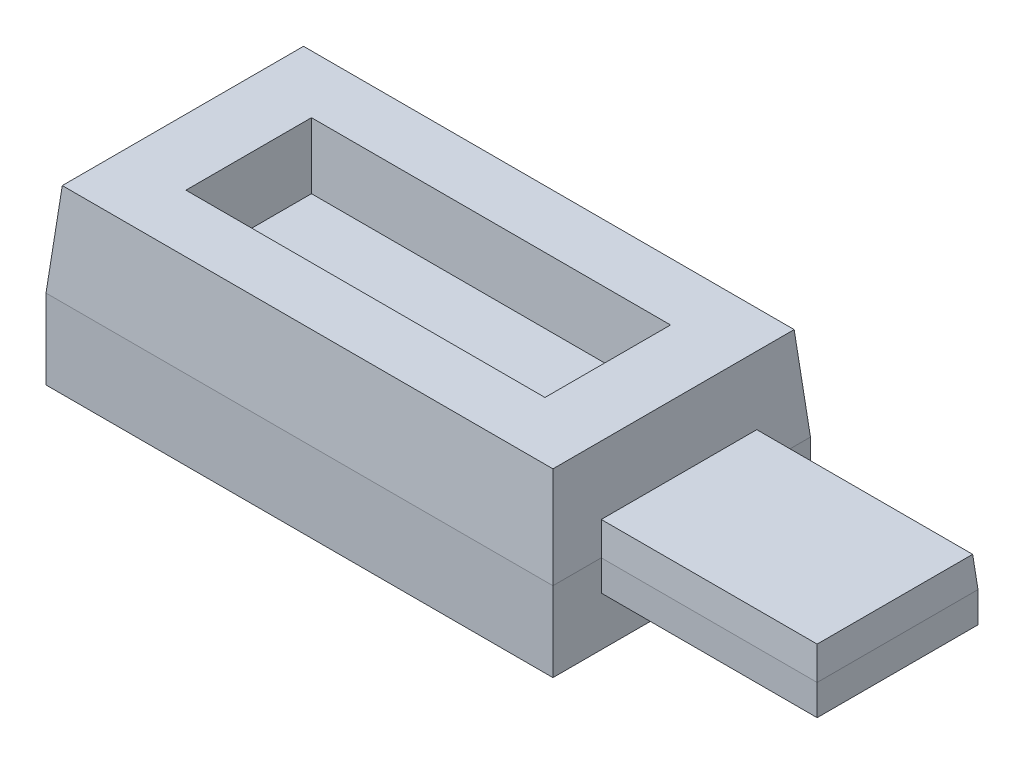
ISO-10303-21;
HEADER;
FILE_DESCRIPTION(('STEP AP214'),'2;1');
FILE_NAME('part.step','',(''),(''),'','','');
FILE_SCHEMA(('AUTOMOTIVE_DESIGN { 1 0 10303 214 1 1 1 1 }'));
ENDSEC;
DATA;
#1=APPLICATION_CONTEXT('core data for automotive mechanical design processes');
#2=APPLICATION_PROTOCOL_DEFINITION('international standard','automotive_design',2000,#1);
#3=PRODUCT_CONTEXT('',#1,'mechanical');
#4=PRODUCT('Part','Part','',(#3));
#5=PRODUCT_RELATED_PRODUCT_CATEGORY('part','',(#4));
#6=PRODUCT_DEFINITION_FORMATION('','',#4);
#7=PRODUCT_DEFINITION_CONTEXT('part definition',#1,'design');
#8=PRODUCT_DEFINITION('design','',#6,#7);
#9=PRODUCT_DEFINITION_SHAPE('','',#8);
#10=(LENGTH_UNIT() NAMED_UNIT(*) SI_UNIT(.MILLI.,.METRE.));
#11=(NAMED_UNIT(*) PLANE_ANGLE_UNIT() SI_UNIT($,.RADIAN.));
#12=(NAMED_UNIT(*) SI_UNIT($,.STERADIAN.) SOLID_ANGLE_UNIT());
#13=UNCERTAINTY_MEASURE_WITH_UNIT(LENGTH_MEASURE(1.E-05),#10,'distance_accuracy_value','');
#14=(GEOMETRIC_REPRESENTATION_CONTEXT(3) GLOBAL_UNCERTAINTY_ASSIGNED_CONTEXT((#13)) GLOBAL_UNIT_ASSIGNED_CONTEXT((#10,
#11,#12)) REPRESENTATION_CONTEXT('',''));
#15=CARTESIAN_POINT('',(0.,0.,0.));
#16=DIRECTION('',(0.,0.,1.));
#17=DIRECTION('',(1.,0.,0.));
#18=AXIS2_PLACEMENT_3D('',#15,#16,#17);
#19=CARTESIAN_POINT('',(-102.892841401862,32.3217631467672,52.2673742227546));
#20=DIRECTION('',(-0.996194698091746,0.0871557427476582,0.));
#21=DIRECTION('',(-0.0871557427476582,-0.996194698091746,0.));
#22=AXIS2_PLACEMENT_3D('',#19,#20,#21);
#23=PLANE('',#22);
#24=DIRECTION('',(0.,0.,-1.));
#25=VECTOR('',#24,1.);
#26=CARTESIAN_POINT('',(-102.892841401862,32.3217631467672,52.2673742227546));
#27=LINE('',#26,#25);
#28=CARTESIAN_POINT('',(-102.892841401862,32.3217631467672,52.2673742227546));
#29=VERTEX_POINT('',#28);
#30=CARTESIAN_POINT('',(-102.892841401862,32.3217631467672,-52.2673742227546));
#31=VERTEX_POINT('',#30);
#32=EDGE_CURVE('E11',#29,#31,#27,.T.);
#33=ORIENTED_EDGE('',*,*,#32,.F.);
#34=DIRECTION('',(-0.0868265938642476,-0.992432509138967,0.0868265938642476));
#35=VECTOR('',#34,1.);
#36=CARTESIAN_POINT('',(-102.892841401862,32.3217631467672,52.2673742227546));
#37=LINE('',#36,#35);
#38=CARTESIAN_POINT('',(-99.5873239945532,70.104,48.9618568154454));
#39=VERTEX_POINT('',#38);
#40=EDGE_CURVE('E258',#39,#29,#37,.T.);
#41=ORIENTED_EDGE('',*,*,#40,.F.);
#42=DIRECTION('',(0.,0.,-1.));
#43=VECTOR('',#42,1.);
#44=CARTESIAN_POINT('',(-99.5873239945532,70.104,0.));
#45=LINE('',#44,#43);
#46=CARTESIAN_POINT('',(-99.5873239945532,70.104,-48.9618568154454));
#47=VERTEX_POINT('',#46);
#48=EDGE_CURVE('E204',#47,#39,#45,.F.);
#49=ORIENTED_EDGE('',*,*,#48,.F.);
#50=DIRECTION('',(-0.0868265938642476,-0.992432509138967,-0.0868265938642476));
#51=VECTOR('',#50,1.);
#52=CARTESIAN_POINT('',(-102.104768839771,41.3294737498458,-51.479301660663));
#53=LINE('',#52,#51);
#54=EDGE_CURVE('E261',#47,#31,#53,.T.);
#55=ORIENTED_EDGE('',*,*,#54,.T.);
#56=EDGE_LOOP('',(#33,#41,#49,#55));
#57=FACE_BOUND('',#56,.T.);
#58=ADVANCED_FACE('F42',(#57),#23,.T.);
#59=CARTESIAN_POINT('',(-102.892841401862,32.3217631467672,-52.2673742227546));
#60=DIRECTION('',(0.,0.0871557427476582,-0.996194698091746));
#61=DIRECTION('',(0.,0.996194698091746,0.0871557427476582));
#62=AXIS2_PLACEMENT_3D('',#59,#60,#61);
#63=PLANE('',#62);
#64=DIRECTION('',(1.,0.,0.));
#65=VECTOR('',#64,1.);
#66=CARTESIAN_POINT('',(-102.892841401862,32.3217631467672,-52.2673742227546));
#67=LINE('',#66,#65);
#68=CARTESIAN_POINT('',(102.892841401862,32.3217631467672,-52.2673742227546));
#69=VERTEX_POINT('',#68);
#70=EDGE_CURVE('E53',#31,#69,#67,.T.);
#71=ORIENTED_EDGE('',*,*,#70,.F.);
#72=ORIENTED_EDGE('',*,*,#54,.F.);
#73=DIRECTION('',(1.,0.,0.));
#74=VECTOR('',#73,1.);
#75=CARTESIAN_POINT('',(0.,70.104,-48.9618568154454));
#76=LINE('',#75,#74);
#77=CARTESIAN_POINT('',(99.5873239945532,70.104,-48.9618568154454));
#78=VERTEX_POINT('',#77);
#79=EDGE_CURVE('E207',#78,#47,#76,.F.);
#80=ORIENTED_EDGE('',*,*,#79,.F.);
#81=DIRECTION('',(0.0868265938642476,-0.992432509138967,-0.0868265938642476));
#82=VECTOR('',#81,1.);
#83=CARTESIAN_POINT('',(101.341452483818,50.0542196219376,-50.7159853047104));
#84=LINE('',#83,#82);
#85=EDGE_CURVE('E264',#78,#69,#84,.T.);
#86=ORIENTED_EDGE('',*,*,#85,.T.);
#87=EDGE_LOOP('',(#71,#72,#80,#86));
#88=FACE_BOUND('',#87,.T.);
#89=ADVANCED_FACE('F326',(#88),#63,.T.);
#90=CARTESIAN_POINT('',(190.522841401863,32.3217631467673,-32.6490823699169));
#91=DIRECTION('',(0.,0.0871557427476582,-0.996194698091746));
#92=DIRECTION('',(0.,0.996194698091746,0.0871557427476582));
#93=AXIS2_PLACEMENT_3D('',#90,#91,#92);
#94=PLANE('',#93);
#95=DIRECTION('',(1.,0.,0.));
#96=VECTOR('',#95,1.);
#97=CARTESIAN_POINT('',(190.522841401863,32.3217631467673,-32.6490823699169));
#98=LINE('',#97,#96);
#99=CARTESIAN_POINT('',(102.892841401862,32.3217631467673,-32.6490823699169));
#100=VERTEX_POINT('',#99);
#101=CARTESIAN_POINT('',(190.522841401863,32.3217631467673,-32.6490823699169));
#102=VERTEX_POINT('',#101);
#103=EDGE_CURVE('E171',#100,#102,#98,.T.);
#104=ORIENTED_EDGE('',*,*,#103,.F.);
#105=DIRECTION('',(-0.0868265938642476,0.992432509138967,0.0868265938642476));
#106=VECTOR('',#105,1.);
#107=CARTESIAN_POINT('',(102.252668344522,39.6389746749931,-32.0089093125759));
#108=LINE('',#107,#106);
#109=CARTESIAN_POINT('',(101.807997222677,44.7215888552026,-31.5642381907315));
#110=VERTEX_POINT('',#109);
#111=EDGE_CURVE('E224',#100,#110,#108,.T.);
#112=ORIENTED_EDGE('',*,*,#111,.T.);
#113=DIRECTION('',(1.,0.,0.));
#114=VECTOR('',#113,1.);
#115=CARTESIAN_POINT('',(190.522841401863,44.7215888552026,-31.5642381907315));
#116=LINE('',#115,#114);
#117=CARTESIAN_POINT('',(189.437997222677,44.7215888552026,-31.5642381907315));
#118=VERTEX_POINT('',#117);
#119=EDGE_CURVE('E46',#118,#110,#116,.F.);
#120=ORIENTED_EDGE('',*,*,#119,.F.);
#121=DIRECTION('',(-0.0868265938642476,0.992432509138967,0.0868265938642476));
#122=VECTOR('',#121,1.);
#123=CARTESIAN_POINT('',(190.276704625567,35.1351193734538,-32.4029455936218));
#124=LINE('',#123,#122);
#125=EDGE_CURVE('E102',#102,#118,#124,.T.);
#126=ORIENTED_EDGE('',*,*,#125,.F.);
#127=EDGE_LOOP('',(#104,#112,#120,#126));
#128=FACE_BOUND('',#127,.T.);
#129=ADVANCED_FACE('F307',(#128),#94,.T.);
#130=CARTESIAN_POINT('',(190.522841401863,32.3217631467673,0.));
#131=DIRECTION('',(0.996194698091746,0.0871557427476582,0.));
#132=DIRECTION('',(-0.0871557427476582,0.996194698091746,0.));
#133=AXIS2_PLACEMENT_3D('',#130,#131,#132);
#134=PLANE('',#133);
#135=DIRECTION('',(0.,0.,1.));
#136=VECTOR('',#135,1.);
#137=CARTESIAN_POINT('',(190.522841401863,32.3217631467673,0.));
#138=LINE('',#137,#136);
#139=CARTESIAN_POINT('',(190.522841401863,32.3217631467672,32.6490823699169));
#140=VERTEX_POINT('',#139);
#141=EDGE_CURVE('E160',#102,#140,#138,.T.);
#142=ORIENTED_EDGE('',*,*,#141,.F.);
#143=ORIENTED_EDGE('',*,*,#125,.T.);
#144=DIRECTION('',(0.,0.,-1.));
#145=VECTOR('',#144,1.);
#146=CARTESIAN_POINT('',(189.437997222677,44.7215888552026,0.));
#147=LINE('',#146,#145);
#148=CARTESIAN_POINT('',(189.437997222677,44.7215888552026,31.5642381907315));
#149=VERTEX_POINT('',#148);
#150=EDGE_CURVE('E190',#118,#149,#147,.F.);
#151=ORIENTED_EDGE('',*,*,#150,.T.);
#152=DIRECTION('',(0.0868265938642476,-0.992432509138967,0.0868265938642476));
#153=VECTOR('',#152,1.);
#154=CARTESIAN_POINT('',(190.276704625567,35.1351193734538,32.4029455936218));
#155=LINE('',#154,#153);
#156=EDGE_CURVE('E179',#149,#140,#155,.T.);
#157=ORIENTED_EDGE('',*,*,#156,.T.);
#158=EDGE_LOOP('',(#142,#143,#151,#157));
#159=FACE_BOUND('',#158,.T.);
#160=ADVANCED_FACE('F192',(#159),#134,.T.);
#161=CARTESIAN_POINT('',(190.522841401863,32.3217631467673,32.6490823699169));
#162=DIRECTION('',(0.,0.0871557427476582,0.996194698091746));
#163=DIRECTION('',(0.,-0.996194698091746,0.0871557427476582));
#164=AXIS2_PLACEMENT_3D('',#161,#162,#163);
#165=PLANE('',#164);
#166=DIRECTION('',(-1.,0.,0.));
#167=VECTOR('',#166,1.);
#168=CARTESIAN_POINT('',(190.522841401863,32.3217631467673,32.6490823699169));
#169=LINE('',#168,#167);
#170=CARTESIAN_POINT('',(102.892841401862,32.3217631467672,32.6490823699169));
#171=VERTEX_POINT('',#170);
#172=EDGE_CURVE('E172',#140,#171,#169,.T.);
#173=ORIENTED_EDGE('',*,*,#172,.F.);
#174=ORIENTED_EDGE('',*,*,#156,.F.);
#175=DIRECTION('',(1.,0.,0.));
#176=VECTOR('',#175,1.);
#177=CARTESIAN_POINT('',(190.522841401863,44.7215888552026,31.5642381907315));
#178=LINE('',#177,#176);
#179=CARTESIAN_POINT('',(101.807997222677,44.7215888552026,31.5642381907315));
#180=VERTEX_POINT('',#179);
#181=EDGE_CURVE('E219',#149,#180,#178,.F.);
#182=ORIENTED_EDGE('',*,*,#181,.T.);
#183=DIRECTION('',(0.0868265938642476,-0.992432509138967,0.0868265938642476));
#184=VECTOR('',#183,1.);
#185=CARTESIAN_POINT('',(103.040740906613,30.6312640719145,32.7969818746676));
#186=LINE('',#185,#184);
#187=EDGE_CURVE('E180',#180,#171,#186,.T.);
#188=ORIENTED_EDGE('',*,*,#187,.T.);
#189=EDGE_LOOP('',(#173,#174,#182,#188));
#190=FACE_BOUND('',#189,.T.);
#191=ADVANCED_FACE('F177',(#190),#165,.T.);
#192=CARTESIAN_POINT('',(102.892841401862,32.3217631467672,52.2673742227546));
#193=DIRECTION('',(0.996194698091746,0.0871557427476582,0.));
#194=DIRECTION('',(-0.0871557427476582,0.996194698091746,0.));
#195=AXIS2_PLACEMENT_3D('',#192,#193,#194);
#196=PLANE('',#195);
#197=DIRECTION('',(0.,0.,-1.));
#198=VECTOR('',#197,1.);
#199=CARTESIAN_POINT('',(102.892841401862,32.3217631467672,52.2673742227546));
#200=LINE('',#199,#198);
#201=EDGE_CURVE('E184',#69,#100,#200,.F.);
#202=ORIENTED_EDGE('',*,*,#201,.F.);
#203=ORIENTED_EDGE('',*,*,#85,.F.);
#204=DIRECTION('',(0.,0.,1.));
#205=VECTOR('',#204,1.);
#206=CARTESIAN_POINT('',(99.5873239945532,70.104,0.));
#207=LINE('',#206,#205);
#208=CARTESIAN_POINT('',(99.5873239945532,70.104,48.9618568154454));
#209=VERTEX_POINT('',#208);
#210=EDGE_CURVE('E210',#209,#78,#207,.F.);
#211=ORIENTED_EDGE('',*,*,#210,.F.);
#212=DIRECTION('',(0.0868265938642476,-0.992432509138967,0.0868265938642476));
#213=VECTOR('',#212,1.);
#214=CARTESIAN_POINT('',(102.892841401862,32.3217631467672,52.2673742227546));
#215=LINE('',#214,#213);
#216=CARTESIAN_POINT('',(102.892841401862,32.3217631467672,52.2673742227546));
#217=VERTEX_POINT('',#216);
#218=EDGE_CURVE('E255',#209,#217,#215,.T.);
#219=ORIENTED_EDGE('',*,*,#218,.T.);
#220=DIRECTION('',(0.,0.,1.));
#221=VECTOR('',#220,1.);
#222=CARTESIAN_POINT('',(102.892841401862,32.3217631467672,52.2673742227546));
#223=LINE('',#222,#221);
#224=EDGE_CURVE('E203',#171,#217,#223,.T.);
#225=ORIENTED_EDGE('',*,*,#224,.F.);
#226=ORIENTED_EDGE('',*,*,#187,.F.);
#227=DIRECTION('',(0.,0.,-1.));
#228=VECTOR('',#227,1.);
#229=CARTESIAN_POINT('',(101.807997222677,44.7215888552026,52.2673742227546));
#230=LINE('',#229,#228);
#231=EDGE_CURVE('E215',#110,#180,#230,.F.);
#232=ORIENTED_EDGE('',*,*,#231,.F.);
#233=ORIENTED_EDGE('',*,*,#111,.F.);
#234=EDGE_LOOP('',(#202,#203,#211,#219,#225,#226,#232,#233));
#235=FACE_BOUND('',#234,.T.);
#236=ADVANCED_FACE('F311',(#235),#196,.T.);
#237=CARTESIAN_POINT('',(-102.892841401862,32.3217631467672,52.2673742227546));
#238=DIRECTION('',(0.,0.0871557427476582,0.996194698091746));
#239=DIRECTION('',(0.,-0.996194698091746,0.0871557427476582));
#240=AXIS2_PLACEMENT_3D('',#237,#238,#239);
#241=PLANE('',#240);
#242=DIRECTION('',(-1.,0.,0.));
#243=VECTOR('',#242,1.);
#244=CARTESIAN_POINT('',(-102.892841401862,32.3217631467672,52.2673742227546));
#245=LINE('',#244,#243);
#246=EDGE_CURVE('E288',#217,#29,#245,.T.);
#247=ORIENTED_EDGE('',*,*,#246,.F.);
#248=ORIENTED_EDGE('',*,*,#218,.F.);
#249=DIRECTION('',(-1.,0.,0.));
#250=VECTOR('',#249,1.);
#251=CARTESIAN_POINT('',(0.,70.104,48.9618568154454));
#252=LINE('',#251,#250);
#253=EDGE_CURVE('E206',#39,#209,#252,.F.);
#254=ORIENTED_EDGE('',*,*,#253,.F.);
#255=ORIENTED_EDGE('',*,*,#40,.T.);
#256=EDGE_LOOP('',(#247,#248,#254,#255));
#257=FACE_BOUND('',#256,.T.);
#258=ADVANCED_FACE('F44',(#257),#241,.T.);
#259=CARTESIAN_POINT('',(102.892841401862,70.104,52.2673742227546));
#260=DIRECTION('',(-1.,0.,0.));
#261=DIRECTION('',(0.,0.,1.));
#262=AXIS2_PLACEMENT_3D('',#259,#260,#261);
#263=PLANE('',#262);
#264=DIRECTION('',(0.,-1.,0.));
#265=VECTOR('',#264,1.);
#266=CARTESIAN_POINT('',(102.892841401862,70.104,-52.2673742227546));
#267=LINE('',#266,#265);
#268=CARTESIAN_POINT('',(102.892841401862,0.,-52.2673742227546));
#269=VERTEX_POINT('',#268);
#270=EDGE_CURVE('E262',#69,#269,#267,.T.);
#271=ORIENTED_EDGE('',*,*,#270,.F.);
#272=ORIENTED_EDGE('',*,*,#201,.T.);
#273=DIRECTION('',(0.,1.,0.));
#274=VECTOR('',#273,1.);
#275=CARTESIAN_POINT('',(102.892841401862,19.9219374383319,-32.6490823699169));
#276=LINE('',#275,#274);
#277=CARTESIAN_POINT('',(102.892841401862,19.9219374383319,-32.6490823699169));
#278=VERTEX_POINT('',#277);
#279=EDGE_CURVE('E110',#278,#100,#276,.T.);
#280=ORIENTED_EDGE('',*,*,#279,.F.);
#281=DIRECTION('',(0.,0.,-1.));
#282=VECTOR('',#281,1.);
#283=CARTESIAN_POINT('',(102.892841401862,19.9219374383319,32.6490823699169));
#284=LINE('',#283,#282);
#285=CARTESIAN_POINT('',(102.892841401862,19.9219374383319,32.6490823699169));
#286=VERTEX_POINT('',#285);
#287=EDGE_CURVE('E221',#286,#278,#284,.T.);
#288=ORIENTED_EDGE('',*,*,#287,.F.);
#289=DIRECTION('',(0.,-1.,0.));
#290=VECTOR('',#289,1.);
#291=CARTESIAN_POINT('',(102.892841401862,19.9219374383319,32.6490823699169));
#292=LINE('',#291,#290);
#293=EDGE_CURVE('E218',#171,#286,#292,.T.);
#294=ORIENTED_EDGE('',*,*,#293,.F.);
#295=ORIENTED_EDGE('',*,*,#224,.T.);
#296=DIRECTION('',(0.,-1.,0.));
#297=VECTOR('',#296,1.);
#298=CARTESIAN_POINT('',(102.892841401862,70.104,52.2673742227546));
#299=LINE('',#298,#297);
#300=CARTESIAN_POINT('',(102.892841401862,0.,52.2673742227546));
#301=VERTEX_POINT('',#300);
#302=EDGE_CURVE('E209',#217,#301,#299,.T.);
#303=ORIENTED_EDGE('',*,*,#302,.T.);
#304=DIRECTION('',(0.,0.,-1.));
#305=VECTOR('',#304,1.);
#306=CARTESIAN_POINT('',(102.892841401862,0.,52.2673742227546));
#307=LINE('',#306,#305);
#308=EDGE_CURVE('E242',#301,#269,#307,.T.);
#309=ORIENTED_EDGE('',*,*,#308,.T.);
#310=EDGE_LOOP('',(#271,#272,#280,#288,#294,#295,#303,#309));
#311=FACE_BOUND('',#310,.T.);
#312=ADVANCED_FACE('F345',(#311),#263,.F.);
#313=CARTESIAN_POINT('',(-102.892841401862,70.104,-52.2673742227546));
#314=DIRECTION('',(0.,0.,1.));
#315=DIRECTION('',(1.,0.,0.));
#316=AXIS2_PLACEMENT_3D('',#313,#314,#315);
#317=PLANE('',#316);
#318=DIRECTION('',(0.,-1.,0.));
#319=VECTOR('',#318,1.);
#320=CARTESIAN_POINT('',(-102.892841401862,70.104,-52.2673742227546));
#321=LINE('',#320,#319);
#322=CARTESIAN_POINT('',(-102.892841401862,0.,-52.2673742227546));
#323=VERTEX_POINT('',#322);
#324=EDGE_CURVE('E259',#31,#323,#321,.T.);
#325=ORIENTED_EDGE('',*,*,#324,.F.);
#326=ORIENTED_EDGE('',*,*,#70,.T.);
#327=ORIENTED_EDGE('',*,*,#270,.T.);
#328=DIRECTION('',(-1.,0.,0.));
#329=VECTOR('',#328,1.);
#330=CARTESIAN_POINT('',(-102.892841401862,0.,-52.2673742227546));
#331=LINE('',#330,#329);
#332=EDGE_CURVE('E245',#269,#323,#331,.T.);
#333=ORIENTED_EDGE('',*,*,#332,.T.);
#334=EDGE_LOOP('',(#325,#326,#327,#333));
#335=FACE_BOUND('',#334,.T.);
#336=ADVANCED_FACE('F349',(#335),#317,.F.);
#337=CARTESIAN_POINT('',(-102.892841401862,70.104,52.2673742227546));
#338=DIRECTION('',(1.,0.,0.));
#339=DIRECTION('',(0.,0.,-1.));
#340=AXIS2_PLACEMENT_3D('',#337,#338,#339);
#341=PLANE('',#340);
#342=DIRECTION('',(0.,-1.,0.));
#343=VECTOR('',#342,1.);
#344=CARTESIAN_POINT('',(-102.892841401862,70.104,52.2673742227546));
#345=LINE('',#344,#343);
#346=CARTESIAN_POINT('',(-102.892841401862,0.,52.2673742227546));
#347=VERTEX_POINT('',#346);
#348=EDGE_CURVE('E256',#29,#347,#345,.T.);
#349=ORIENTED_EDGE('',*,*,#348,.F.);
#350=ORIENTED_EDGE('',*,*,#32,.T.);
#351=ORIENTED_EDGE('',*,*,#324,.T.);
#352=DIRECTION('',(0.,0.,1.));
#353=VECTOR('',#352,1.);
#354=CARTESIAN_POINT('',(-102.892841401862,0.,52.2673742227546));
#355=LINE('',#354,#353);
#356=EDGE_CURVE('E249',#323,#347,#355,.T.);
#357=ORIENTED_EDGE('',*,*,#356,.T.);
#358=EDGE_LOOP('',(#349,#350,#351,#357));
#359=FACE_BOUND('',#358,.T.);
#360=ADVANCED_FACE('F371',(#359),#341,.F.);
#361=CARTESIAN_POINT('',(-102.892841401862,70.104,52.2673742227546));
#362=DIRECTION('',(0.,0.,-1.));
#363=DIRECTION('',(-1.,0.,0.));
#364=AXIS2_PLACEMENT_3D('',#361,#362,#363);
#365=PLANE('',#364);
#366=ORIENTED_EDGE('',*,*,#302,.F.);
#367=ORIENTED_EDGE('',*,*,#246,.T.);
#368=ORIENTED_EDGE('',*,*,#348,.T.);
#369=DIRECTION('',(1.,0.,0.));
#370=VECTOR('',#369,1.);
#371=CARTESIAN_POINT('',(-102.892841401862,0.,52.2673742227546));
#372=LINE('',#371,#370);
#373=EDGE_CURVE('E213',#347,#301,#372,.T.);
#374=ORIENTED_EDGE('',*,*,#373,.T.);
#375=EDGE_LOOP('',(#366,#367,#368,#374));
#376=FACE_BOUND('',#375,.T.);
#377=ADVANCED_FACE('F358',(#376),#365,.F.);
#378=CARTESIAN_POINT('',(0.,70.104,0.));
#379=DIRECTION('',(0.,-1.,0.));
#380=DIRECTION('',(0.,0.,-1.));
#381=AXIS2_PLACEMENT_3D('',#378,#379,#380);
#382=PLANE('',#381);
#383=DIRECTION('',(-1.,0.,0.));
#384=VECTOR('',#383,1.);
#385=CARTESIAN_POINT('',(-72.8794328331901,70.104,-25.4870488631695));
#386=LINE('',#385,#384);
#387=CARTESIAN_POINT('',(72.8794328331901,70.104,-25.4870488631695));
#388=VERTEX_POINT('',#387);
#389=CARTESIAN_POINT('',(-72.8794328331901,70.104,-25.4870488631695));
#390=VERTEX_POINT('',#389);
#391=EDGE_CURVE('E232',#388,#390,#386,.T.);
#392=ORIENTED_EDGE('',*,*,#391,.F.);
#393=DIRECTION('',(0.,0.,-1.));
#394=VECTOR('',#393,1.);
#395=CARTESIAN_POINT('',(72.8794328331901,70.104,25.4870488631695));
#396=LINE('',#395,#394);
#397=CARTESIAN_POINT('',(72.8794328331901,70.104,25.4870488631695));
#398=VERTEX_POINT('',#397);
#399=EDGE_CURVE('E230',#398,#388,#396,.T.);
#400=ORIENTED_EDGE('',*,*,#399,.F.);
#401=DIRECTION('',(1.,0.,0.));
#402=VECTOR('',#401,1.);
#403=CARTESIAN_POINT('',(-72.8794328331901,70.104,25.4870488631695));
#404=LINE('',#403,#402);
#405=CARTESIAN_POINT('',(-72.8794328331901,70.104,25.4870488631695));
#406=VERTEX_POINT('',#405);
#407=EDGE_CURVE('E238',#406,#398,#404,.T.);
#408=ORIENTED_EDGE('',*,*,#407,.F.);
#409=DIRECTION('',(0.,0.,1.));
#410=VECTOR('',#409,1.);
#411=CARTESIAN_POINT('',(-72.8794328331901,70.104,25.4870488631695));
#412=LINE('',#411,#410);
#413=EDGE_CURVE('E235',#390,#406,#412,.T.);
#414=ORIENTED_EDGE('',*,*,#413,.F.);
#415=EDGE_LOOP('',(#392,#400,#408,#414));
#416=FACE_BOUND('',#415,.T.);
#417=ORIENTED_EDGE('',*,*,#210,.T.);
#418=ORIENTED_EDGE('',*,*,#79,.T.);
#419=ORIENTED_EDGE('',*,*,#48,.T.);
#420=ORIENTED_EDGE('',*,*,#253,.T.);
#421=EDGE_LOOP('',(#417,#418,#419,#420));
#422=FACE_BOUND('',#421,.T.);
#423=ADVANCED_FACE('F364',(#416,#422),#382,.F.);
#424=CARTESIAN_POINT('',(0.,0.,0.));
#425=DIRECTION('',(0.,-1.,0.));
#426=DIRECTION('',(0.,0.,-1.));
#427=AXIS2_PLACEMENT_3D('',#424,#425,#426);
#428=PLANE('',#427);
#429=ORIENTED_EDGE('',*,*,#308,.F.);
#430=ORIENTED_EDGE('',*,*,#373,.F.);
#431=ORIENTED_EDGE('',*,*,#356,.F.);
#432=ORIENTED_EDGE('',*,*,#332,.F.);
#433=EDGE_LOOP('',(#429,#430,#431,#432));
#434=FACE_BOUND('',#433,.T.);
#435=ADVANCED_FACE('F373',(#434),#428,.T.);
#436=CARTESIAN_POINT('',(72.8794328331901,70.104,25.4870488631695));
#437=DIRECTION('',(-0.998629534754574,0.0523359562429439,0.));
#438=DIRECTION('',(-0.052335956242944,-0.998629534754574,0.));
#439=AXIS2_PLACEMENT_3D('',#436,#437,#438);
#440=PLANE('',#439);
#441=ORIENTED_EDGE('',*,*,#399,.T.);
#442=DIRECTION('',(0.052264427688714,0.997264688634237,-0.052264427688714));
#443=VECTOR('',#442,1.);
#444=CARTESIAN_POINT('',(72.7401934965911,67.4471551860459,-25.3478095265706));
#445=LINE('',#444,#443);
#446=CARTESIAN_POINT('',(71.5482752394008,44.704,-24.1558912693803));
#447=VERTEX_POINT('',#446);
#448=EDGE_CURVE('E269',#447,#388,#445,.T.);
#449=ORIENTED_EDGE('',*,*,#448,.F.);
#450=DIRECTION('',(0.,0.,1.));
#451=VECTOR('',#450,1.);
#452=CARTESIAN_POINT('',(71.5482752394008,44.704,25.4870488631695));
#453=LINE('',#452,#451);
#454=CARTESIAN_POINT('',(71.5482752394008,44.704,24.1558912693803));
#455=VERTEX_POINT('',#454);
#456=EDGE_CURVE('E241',#455,#447,#453,.F.);
#457=ORIENTED_EDGE('',*,*,#456,.F.);
#458=DIRECTION('',(0.052264427688714,0.997264688634237,0.052264427688714));
#459=VECTOR('',#458,1.);
#460=CARTESIAN_POINT('',(72.4812822299608,62.5068339174808,25.0888982599403));
#461=LINE('',#460,#459);
#462=EDGE_CURVE('E246',#455,#398,#461,.T.);
#463=ORIENTED_EDGE('',*,*,#462,.T.);
#464=EDGE_LOOP('',(#441,#449,#457,#463));
#465=FACE_BOUND('',#464,.T.);
#466=ADVANCED_FACE('F376',(#465),#440,.T.);
#467=CARTESIAN_POINT('',(-72.8794328331901,70.104,25.4870488631695));
#468=DIRECTION('',(0.,0.0523359562429439,-0.998629534754574));
#469=DIRECTION('',(0.,0.998629534754574,0.052335956242944));
#470=AXIS2_PLACEMENT_3D('',#467,#468,#469);
#471=PLANE('',#470);
#472=ORIENTED_EDGE('',*,*,#407,.T.);
#473=ORIENTED_EDGE('',*,*,#462,.F.);
#474=DIRECTION('',(-1.,0.,0.));
#475=VECTOR('',#474,1.);
#476=CARTESIAN_POINT('',(-72.8794328331901,44.704,24.1558912693803));
#477=LINE('',#476,#475);
#478=CARTESIAN_POINT('',(-71.5482752394008,44.704,24.1558912693803));
#479=VERTEX_POINT('',#478);
#480=EDGE_CURVE('E272',#479,#455,#477,.F.);
#481=ORIENTED_EDGE('',*,*,#480,.F.);
#482=DIRECTION('',(-0.052264427688714,0.997264688634237,0.052264427688714));
#483=VECTOR('',#482,1.);
#484=CARTESIAN_POINT('',(-72.8794328331901,70.104,25.4870488631695));
#485=LINE('',#484,#483);
#486=EDGE_CURVE('E266',#479,#406,#485,.T.);
#487=ORIENTED_EDGE('',*,*,#486,.T.);
#488=EDGE_LOOP('',(#472,#473,#481,#487));
#489=FACE_BOUND('',#488,.T.);
#490=ADVANCED_FACE('F381',(#489),#471,.T.);
#491=CARTESIAN_POINT('',(-72.8794328331901,70.104,25.4870488631695));
#492=DIRECTION('',(0.998629534754574,0.0523359562429439,0.));
#493=DIRECTION('',(-0.052335956242944,0.998629534754574,0.));
#494=AXIS2_PLACEMENT_3D('',#491,#492,#493);
#495=PLANE('',#494);
#496=ORIENTED_EDGE('',*,*,#413,.T.);
#497=ORIENTED_EDGE('',*,*,#486,.F.);
#498=DIRECTION('',(0.,0.,-1.));
#499=VECTOR('',#498,1.);
#500=CARTESIAN_POINT('',(-71.5482752394008,44.704,25.4870488631695));
#501=LINE('',#500,#499);
#502=CARTESIAN_POINT('',(-71.5482752394008,44.704,-24.1558912693803));
#503=VERTEX_POINT('',#502);
#504=EDGE_CURVE('E276',#503,#479,#501,.F.);
#505=ORIENTED_EDGE('',*,*,#504,.F.);
#506=DIRECTION('',(-0.052264427688714,0.997264688634237,-0.052264427688714));
#507=VECTOR('',#506,1.);
#508=CARTESIAN_POINT('',(-72.8794328331901,70.104,-25.4870488631695));
#509=LINE('',#508,#507);
#510=EDGE_CURVE('E268',#503,#390,#509,.T.);
#511=ORIENTED_EDGE('',*,*,#510,.T.);
#512=EDGE_LOOP('',(#496,#497,#505,#511));
#513=FACE_BOUND('',#512,.T.);
#514=ADVANCED_FACE('F334',(#513),#495,.T.);
#515=CARTESIAN_POINT('',(-72.8794328331901,70.104,-25.4870488631695));
#516=DIRECTION('',(0.,0.0523359562429439,0.998629534754574));
#517=DIRECTION('',(0.,-0.998629534754574,0.052335956242944));
#518=AXIS2_PLACEMENT_3D('',#515,#516,#517);
#519=PLANE('',#518);
#520=ORIENTED_EDGE('',*,*,#391,.T.);
#521=ORIENTED_EDGE('',*,*,#510,.F.);
#522=DIRECTION('',(1.,0.,0.));
#523=VECTOR('',#522,1.);
#524=CARTESIAN_POINT('',(-72.8794328331901,44.704,-24.1558912693803));
#525=LINE('',#524,#523);
#526=EDGE_CURVE('E279',#447,#503,#525,.F.);
#527=ORIENTED_EDGE('',*,*,#526,.F.);
#528=ORIENTED_EDGE('',*,*,#448,.T.);
#529=EDGE_LOOP('',(#520,#521,#527,#528));
#530=FACE_BOUND('',#529,.T.);
#531=ADVANCED_FACE('F396',(#530),#519,.T.);
#532=CARTESIAN_POINT('',(0.,44.704,0.));
#533=DIRECTION('',(0.,-1.,0.));
#534=DIRECTION('',(0.,0.,-1.));
#535=AXIS2_PLACEMENT_3D('',#532,#533,#534);
#536=PLANE('',#535);
#537=ORIENTED_EDGE('',*,*,#456,.T.);
#538=ORIENTED_EDGE('',*,*,#526,.T.);
#539=ORIENTED_EDGE('',*,*,#504,.T.);
#540=ORIENTED_EDGE('',*,*,#480,.T.);
#541=EDGE_LOOP('',(#537,#538,#539,#540));
#542=FACE_BOUND('',#541,.T.);
#543=ADVANCED_FACE('F322',(#542),#536,.F.);
#544=CARTESIAN_POINT('',(190.522841401863,19.9219374383319,-32.6490823699169));
#545=DIRECTION('',(0.,0.,1.));
#546=DIRECTION('',(1.,0.,0.));
#547=AXIS2_PLACEMENT_3D('',#544,#545,#546);
#548=PLANE('',#547);
#549=ORIENTED_EDGE('',*,*,#279,.T.);
#550=ORIENTED_EDGE('',*,*,#103,.T.);
#551=DIRECTION('',(0.,1.,0.));
#552=VECTOR('',#551,1.);
#553=CARTESIAN_POINT('',(190.522841401863,19.9219374383319,-32.6490823699169));
#554=LINE('',#553,#552);
#555=CARTESIAN_POINT('',(190.522841401863,19.9219374383319,-32.6490823699169));
#556=VERTEX_POINT('',#555);
#557=EDGE_CURVE('E168',#556,#102,#554,.T.);
#558=ORIENTED_EDGE('',*,*,#557,.F.);
#559=DIRECTION('',(-1.,0.,0.));
#560=VECTOR('',#559,1.);
#561=CARTESIAN_POINT('',(190.522841401863,19.9219374383319,-32.6490823699169));
#562=LINE('',#561,#560);
#563=EDGE_CURVE('E196',#556,#278,#562,.T.);
#564=ORIENTED_EDGE('',*,*,#563,.T.);
#565=EDGE_LOOP('',(#549,#550,#558,#564));
#566=FACE_BOUND('',#565,.T.);
#567=ADVANCED_FACE('F315',(#566),#548,.F.);
#568=CARTESIAN_POINT('',(190.522841401863,44.7215888552026,32.6490823699169));
#569=DIRECTION('',(0.,-1.,0.));
#570=DIRECTION('',(0.,0.,-1.));
#571=AXIS2_PLACEMENT_3D('',#568,#569,#570);
#572=PLANE('',#571);
#573=ORIENTED_EDGE('',*,*,#231,.T.);
#574=ORIENTED_EDGE('',*,*,#181,.F.);
#575=ORIENTED_EDGE('',*,*,#150,.F.);
#576=ORIENTED_EDGE('',*,*,#119,.T.);
#577=EDGE_LOOP('',(#573,#574,#575,#576));
#578=FACE_BOUND('',#577,.T.);
#579=ADVANCED_FACE('F313',(#578),#572,.F.);
#580=CARTESIAN_POINT('',(190.522841401863,19.9219374383319,32.6490823699169));
#581=DIRECTION('',(0.,0.,-1.));
#582=DIRECTION('',(-1.,0.,0.));
#583=AXIS2_PLACEMENT_3D('',#580,#581,#582);
#584=PLANE('',#583);
#585=DIRECTION('',(0.,-1.,0.));
#586=VECTOR('',#585,1.);
#587=CARTESIAN_POINT('',(190.522841401863,19.9219374383319,32.6490823699169));
#588=LINE('',#587,#586);
#589=CARTESIAN_POINT('',(190.522841401863,19.9219374383319,32.6490823699169));
#590=VERTEX_POINT('',#589);
#591=EDGE_CURVE('E165',#140,#590,#588,.T.);
#592=ORIENTED_EDGE('',*,*,#591,.F.);
#593=ORIENTED_EDGE('',*,*,#172,.T.);
#594=ORIENTED_EDGE('',*,*,#293,.T.);
#595=DIRECTION('',(-1.,0.,0.));
#596=VECTOR('',#595,1.);
#597=CARTESIAN_POINT('',(190.522841401863,19.9219374383319,32.6490823699169));
#598=LINE('',#597,#596);
#599=EDGE_CURVE('E188',#590,#286,#598,.T.);
#600=ORIENTED_EDGE('',*,*,#599,.F.);
#601=EDGE_LOOP('',(#592,#593,#594,#600));
#602=FACE_BOUND('',#601,.T.);
#603=ADVANCED_FACE('F186',(#602),#584,.F.);
#604=CARTESIAN_POINT('',(190.522841401863,19.9219374383319,32.6490823699169));
#605=DIRECTION('',(0.,1.,0.));
#606=DIRECTION('',(0.,0.,1.));
#607=AXIS2_PLACEMENT_3D('',#604,#605,#606);
#608=PLANE('',#607);
#609=ORIENTED_EDGE('',*,*,#287,.T.);
#610=ORIENTED_EDGE('',*,*,#563,.F.);
#611=DIRECTION('',(0.,0.,-1.));
#612=VECTOR('',#611,1.);
#613=CARTESIAN_POINT('',(190.522841401863,19.9219374383319,32.6490823699169));
#614=LINE('',#613,#612);
#615=EDGE_CURVE('E194',#590,#556,#614,.T.);
#616=ORIENTED_EDGE('',*,*,#615,.F.);
#617=ORIENTED_EDGE('',*,*,#599,.T.);
#618=EDGE_LOOP('',(#609,#610,#616,#617));
#619=FACE_BOUND('',#618,.T.);
#620=ADVANCED_FACE('F320',(#619),#608,.F.);
#621=CARTESIAN_POINT('',(190.522841401863,0.,0.));
#622=DIRECTION('',(-1.,0.,0.));
#623=DIRECTION('',(0.,0.,1.));
#624=AXIS2_PLACEMENT_3D('',#621,#622,#623);
#625=PLANE('',#624);
#626=ORIENTED_EDGE('',*,*,#557,.T.);
#627=ORIENTED_EDGE('',*,*,#141,.T.);
#628=ORIENTED_EDGE('',*,*,#591,.T.);
#629=ORIENTED_EDGE('',*,*,#615,.T.);
#630=EDGE_LOOP('',(#626,#627,#628,#629));
#631=FACE_BOUND('',#630,.T.);
#632=ADVANCED_FACE('F162',(#631),#625,.F.);
#633=CLOSED_SHELL('',(#58,#89,#129,#160,#191,#236,#258,#312,#336,#360,#377,#423,#435,#466,#490,
#514,#531,#543,#567,#579,#603,#620,#632));
#634=MANIFOLD_SOLID_BREP('B2',#633);
#635=ADVANCED_BREP_SHAPE_REPRESENTATION('',(#18,#634),#14);
#636=SHAPE_DEFINITION_REPRESENTATION(#9,#635);
ENDSEC;
END-ISO-10303-21;
